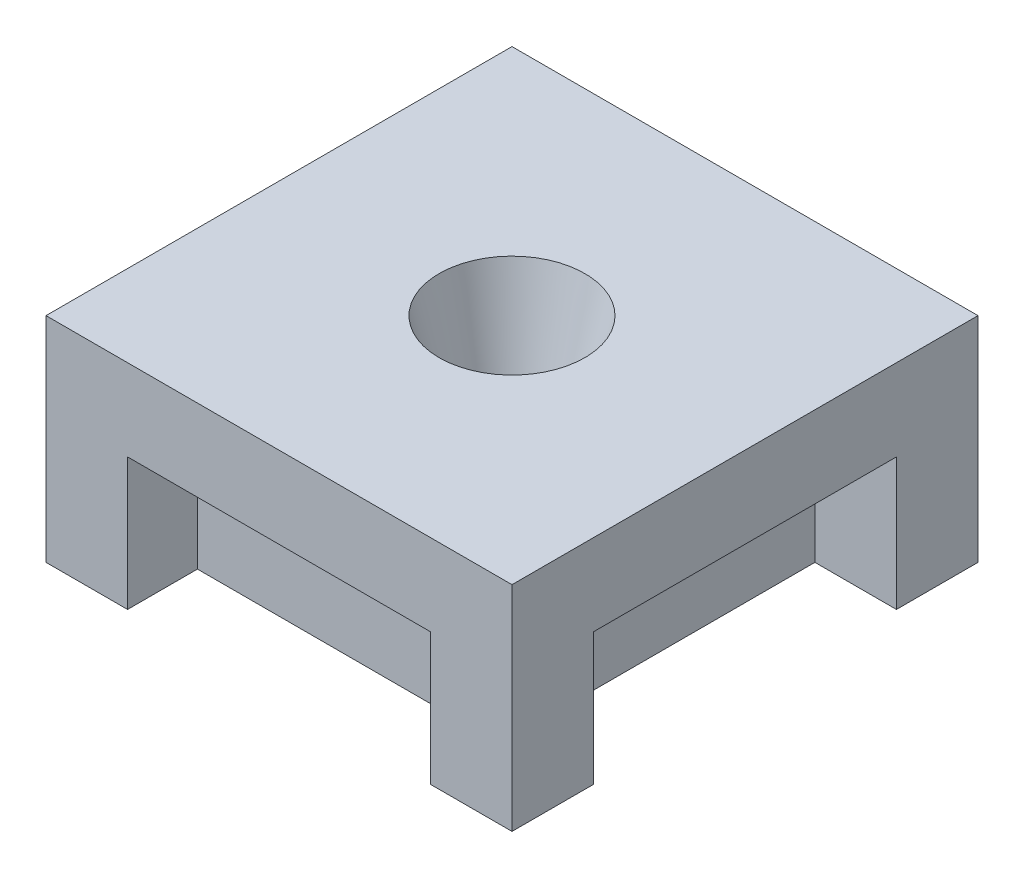
ISO-10303-21;
HEADER;
FILE_DESCRIPTION(('STEP AP214'),'2;1');
FILE_NAME('part.step','',(''),(''),'','','');
FILE_SCHEMA(('AUTOMOTIVE_DESIGN { 1 0 10303 214 1 1 1 1 }'));
ENDSEC;
DATA;
#1=APPLICATION_CONTEXT('core data for automotive mechanical design processes');
#2=APPLICATION_PROTOCOL_DEFINITION('international standard','automotive_design',2000,#1);
#3=PRODUCT_CONTEXT('',#1,'mechanical');
#4=PRODUCT('Part','Part','',(#3));
#5=PRODUCT_RELATED_PRODUCT_CATEGORY('part','',(#4));
#6=PRODUCT_DEFINITION_FORMATION('','',#4);
#7=PRODUCT_DEFINITION_CONTEXT('part definition',#1,'design');
#8=PRODUCT_DEFINITION('design','',#6,#7);
#9=PRODUCT_DEFINITION_SHAPE('','',#8);
#10=(LENGTH_UNIT() NAMED_UNIT(*) SI_UNIT(.MILLI.,.METRE.));
#11=(NAMED_UNIT(*) PLANE_ANGLE_UNIT() SI_UNIT($,.RADIAN.));
#12=(NAMED_UNIT(*) SI_UNIT($,.STERADIAN.) SOLID_ANGLE_UNIT());
#13=UNCERTAINTY_MEASURE_WITH_UNIT(LENGTH_MEASURE(1.E-05),#10,'distance_accuracy_value','');
#14=(GEOMETRIC_REPRESENTATION_CONTEXT(3) GLOBAL_UNCERTAINTY_ASSIGNED_CONTEXT((#13)) GLOBAL_UNIT_ASSIGNED_CONTEXT((#10,
#11,#12)) REPRESENTATION_CONTEXT('',''));
#15=CARTESIAN_POINT('',(0.,0.,0.));
#16=DIRECTION('',(0.,0.,1.));
#17=DIRECTION('',(1.,0.,0.));
#18=AXIS2_PLACEMENT_3D('',#15,#16,#17);
#19=CARTESIAN_POINT('',(-33.7032003820875,40.,8.10068404045491));
#20=DIRECTION('',(1.,0.,0.));
#21=DIRECTION('',(0.,0.,-1.));
#22=AXIS2_PLACEMENT_3D('',#19,#20,#21);
#23=PLANE('',#22);
#24=DIRECTION('',(0.,0.,1.));
#25=VECTOR('',#24,1.);
#26=CARTESIAN_POINT('',(-33.7032003820875,21.6555505287818,-22.8993159595451));
#27=LINE('',#26,#25);
#28=CARTESIAN_POINT('',(-33.7032003820875,21.6555505287818,41.1006840404549));
#29=VERTEX_POINT('',#28);
#30=CARTESIAN_POINT('',(-33.7032003820875,21.6555505287818,48.1006840404549));
#31=VERTEX_POINT('',#30);
#32=EDGE_CURVE('E186',#29,#31,#27,.T.);
#33=ORIENTED_EDGE('',*,*,#32,.T.);
#34=DIRECTION('',(0.,-1.,0.));
#35=VECTOR('',#34,1.);
#36=CARTESIAN_POINT('',(-33.7032003820875,40.,48.1006840404549));
#37=LINE('',#36,#35);
#38=CARTESIAN_POINT('',(-33.7032003820875,40.,48.1006840404549));
#39=VERTEX_POINT('',#38);
#40=EDGE_CURVE('E216',#39,#31,#37,.T.);
#41=ORIENTED_EDGE('',*,*,#40,.F.);
#42=DIRECTION('',(0.,0.,1.));
#43=VECTOR('',#42,1.);
#44=CARTESIAN_POINT('',(-33.7032003820875,40.,8.10068404045491));
#45=LINE('',#44,#43);
#46=CARTESIAN_POINT('',(-33.7032003820875,40.,8.10068404045491));
#47=VERTEX_POINT('',#46);
#48=EDGE_CURVE('E203',#47,#39,#45,.T.);
#49=ORIENTED_EDGE('',*,*,#48,.F.);
#50=DIRECTION('',(0.,-1.,0.));
#51=VECTOR('',#50,1.);
#52=CARTESIAN_POINT('',(-33.7032003820875,40.,8.10068404045491));
#53=LINE('',#52,#51);
#54=CARTESIAN_POINT('',(-33.7032003820875,21.6555505287818,8.10068404045491));
#55=VERTEX_POINT('',#54);
#56=EDGE_CURVE('E193',#47,#55,#53,.T.);
#57=ORIENTED_EDGE('',*,*,#56,.T.);
#58=CARTESIAN_POINT('',(-33.7032003820875,21.6555505287818,15.1006840404549));
#59=VERTEX_POINT('',#58);
#60=EDGE_CURVE('E175',#55,#59,#27,.T.);
#61=ORIENTED_EDGE('',*,*,#60,.T.);
#62=DIRECTION('',(0.,-1.,0.));
#63=VECTOR('',#62,1.);
#64=CARTESIAN_POINT('',(-33.7032003820875,33.,15.1006840404549));
#65=LINE('',#64,#63);
#66=CARTESIAN_POINT('',(-33.7032003820875,33.,15.1006840404549));
#67=VERTEX_POINT('',#66);
#68=EDGE_CURVE('E393',#67,#59,#65,.T.);
#69=ORIENTED_EDGE('',*,*,#68,.F.);
#70=DIRECTION('',(0.,0.,-1.));
#71=VECTOR('',#70,1.);
#72=CARTESIAN_POINT('',(-33.7032003820875,33.,41.1006840404549));
#73=LINE('',#72,#71);
#74=CARTESIAN_POINT('',(-33.7032003820875,33.,41.1006840404549));
#75=VERTEX_POINT('',#74);
#76=EDGE_CURVE('E401',#75,#67,#73,.T.);
#77=ORIENTED_EDGE('',*,*,#76,.F.);
#78=DIRECTION('',(0.,1.,0.));
#79=VECTOR('',#78,1.);
#80=CARTESIAN_POINT('',(-33.7032003820875,33.,41.1006840404549));
#81=LINE('',#80,#79);
#82=EDGE_CURVE('E61',#29,#75,#81,.T.);
#83=ORIENTED_EDGE('',*,*,#82,.F.);
#84=EDGE_LOOP('',(#33,#41,#49,#57,#61,#69,#77,#83));
#85=FACE_BOUND('',#84,.T.);
#86=ADVANCED_FACE('F39',(#85),#23,.F.);
#87=CARTESIAN_POINT('',(-33.7032003820875,40.,48.1006840404549));
#88=DIRECTION('',(0.,0.,-1.));
#89=DIRECTION('',(-1.,0.,0.));
#90=AXIS2_PLACEMENT_3D('',#87,#88,#89);
#91=PLANE('',#90);
#92=DIRECTION('',(-1.,0.,0.));
#93=VECTOR('',#92,1.);
#94=CARTESIAN_POINT('',(-33.7032003820875,21.6555505287818,48.1006840404549));
#95=LINE('',#94,#93);
#96=CARTESIAN_POINT('',(6.29679961791253,21.6555505287818,48.1006840404549));
#97=VERTEX_POINT('',#96);
#98=CARTESIAN_POINT('',(-0.703200382087465,21.6555505287818,48.1006840404549));
#99=VERTEX_POINT('',#98);
#100=EDGE_CURVE('E430',#97,#99,#95,.T.);
#101=ORIENTED_EDGE('',*,*,#100,.F.);
#102=DIRECTION('',(0.,-1.,0.));
#103=VECTOR('',#102,1.);
#104=CARTESIAN_POINT('',(6.29679961791253,40.,48.1006840404549));
#105=LINE('',#104,#103);
#106=CARTESIAN_POINT('',(6.29679961791253,40.,48.1006840404549));
#107=VERTEX_POINT('',#106);
#108=EDGE_CURVE('E208',#107,#97,#105,.T.);
#109=ORIENTED_EDGE('',*,*,#108,.F.);
#110=DIRECTION('',(1.,0.,0.));
#111=VECTOR('',#110,1.);
#112=CARTESIAN_POINT('',(-33.7032003820875,40.,48.1006840404549));
#113=LINE('',#112,#111);
#114=EDGE_CURVE('E409',#39,#107,#113,.T.);
#115=ORIENTED_EDGE('',*,*,#114,.F.);
#116=ORIENTED_EDGE('',*,*,#40,.T.);
#117=CARTESIAN_POINT('',(-26.7032003820875,21.6555505287818,48.1006840404549));
#118=VERTEX_POINT('',#117);
#119=EDGE_CURVE('E446',#118,#31,#95,.T.);
#120=ORIENTED_EDGE('',*,*,#119,.F.);
#121=DIRECTION('',(0.,-1.,0.));
#122=VECTOR('',#121,1.);
#123=CARTESIAN_POINT('',(-26.7032003820875,33.,48.1006840404549));
#124=LINE('',#123,#122);
#125=CARTESIAN_POINT('',(-26.7032003820875,33.,48.1006840404549));
#126=VERTEX_POINT('',#125);
#127=EDGE_CURVE('E347',#126,#118,#124,.T.);
#128=ORIENTED_EDGE('',*,*,#127,.F.);
#129=DIRECTION('',(-1.,0.,0.));
#130=VECTOR('',#129,1.);
#131=CARTESIAN_POINT('',(-26.7032003820875,33.,48.1006840404549));
#132=LINE('',#131,#130);
#133=CARTESIAN_POINT('',(-0.703200382087467,33.,48.1006840404549));
#134=VERTEX_POINT('',#133);
#135=EDGE_CURVE('E354',#134,#126,#132,.T.);
#136=ORIENTED_EDGE('',*,*,#135,.F.);
#137=DIRECTION('',(0.,1.,0.));
#138=VECTOR('',#137,1.);
#139=CARTESIAN_POINT('',(-0.703200382087467,33.,48.1006840404549));
#140=LINE('',#139,#138);
#141=EDGE_CURVE('E362',#99,#134,#140,.T.);
#142=ORIENTED_EDGE('',*,*,#141,.F.);
#143=EDGE_LOOP('',(#101,#109,#115,#116,#120,#128,#136,#142));
#144=FACE_BOUND('',#143,.T.);
#145=ADVANCED_FACE('F245',(#144),#91,.F.);
#146=CARTESIAN_POINT('',(6.29679961791253,40.,8.10068404045491));
#147=DIRECTION('',(-1.,0.,0.));
#148=DIRECTION('',(0.,0.,1.));
#149=AXIS2_PLACEMENT_3D('',#146,#147,#148);
#150=PLANE('',#149);
#151=DIRECTION('',(0.,0.,1.));
#152=VECTOR('',#151,1.);
#153=CARTESIAN_POINT('',(6.29679961791253,21.6555505287818,-22.8993159595451));
#154=LINE('',#153,#152);
#155=CARTESIAN_POINT('',(6.29679961791253,21.6555505287818,8.10068404045491));
#156=VERTEX_POINT('',#155);
#157=CARTESIAN_POINT('',(6.29679961791253,21.6555505287818,15.1006840404549));
#158=VERTEX_POINT('',#157);
#159=EDGE_CURVE('E416',#156,#158,#154,.T.);
#160=ORIENTED_EDGE('',*,*,#159,.F.);
#161=DIRECTION('',(0.,-1.,0.));
#162=VECTOR('',#161,1.);
#163=CARTESIAN_POINT('',(6.29679961791253,40.,8.10068404045491));
#164=LINE('',#163,#162);
#165=CARTESIAN_POINT('',(6.29679961791253,40.,8.10068404045491));
#166=VERTEX_POINT('',#165);
#167=EDGE_CURVE('E204',#166,#156,#164,.T.);
#168=ORIENTED_EDGE('',*,*,#167,.F.);
#169=DIRECTION('',(0.,0.,-1.));
#170=VECTOR('',#169,1.);
#171=CARTESIAN_POINT('',(6.29679961791253,40.,8.10068404045491));
#172=LINE('',#171,#170);
#173=EDGE_CURVE('E210',#107,#166,#172,.T.);
#174=ORIENTED_EDGE('',*,*,#173,.F.);
#175=ORIENTED_EDGE('',*,*,#108,.T.);
#176=CARTESIAN_POINT('',(6.29679961791253,21.6555505287818,41.1006840404549));
#177=VERTEX_POINT('',#176);
#178=EDGE_CURVE('E450',#177,#97,#154,.T.);
#179=ORIENTED_EDGE('',*,*,#178,.F.);
#180=DIRECTION('',(0.,-1.,0.));
#181=VECTOR('',#180,1.);
#182=CARTESIAN_POINT('',(6.29679961791253,33.,41.1006840404549));
#183=LINE('',#182,#181);
#184=CARTESIAN_POINT('',(6.29679961791253,33.,41.1006840404549));
#185=VERTEX_POINT('',#184);
#186=EDGE_CURVE('E341',#185,#177,#183,.T.);
#187=ORIENTED_EDGE('',*,*,#186,.F.);
#188=DIRECTION('',(0.,0.,1.));
#189=VECTOR('',#188,1.);
#190=CARTESIAN_POINT('',(6.29679961791253,33.,41.1006840404549));
#191=LINE('',#190,#189);
#192=CARTESIAN_POINT('',(6.29679961791253,33.,15.1006840404549));
#193=VERTEX_POINT('',#192);
#194=EDGE_CURVE('E329',#193,#185,#191,.T.);
#195=ORIENTED_EDGE('',*,*,#194,.F.);
#196=DIRECTION('',(0.,1.,0.));
#197=VECTOR('',#196,1.);
#198=CARTESIAN_POINT('',(6.29679961791253,33.,15.1006840404549));
#199=LINE('',#198,#197);
#200=EDGE_CURVE('E333',#158,#193,#199,.T.);
#201=ORIENTED_EDGE('',*,*,#200,.F.);
#202=EDGE_LOOP('',(#160,#168,#174,#175,#179,#187,#195,#201));
#203=FACE_BOUND('',#202,.T.);
#204=ADVANCED_FACE('F249',(#203),#150,.F.);
#205=CARTESIAN_POINT('',(-33.7032003820875,40.,8.10068404045491));
#206=DIRECTION('',(0.,0.,1.));
#207=DIRECTION('',(1.,0.,0.));
#208=AXIS2_PLACEMENT_3D('',#205,#206,#207);
#209=PLANE('',#208);
#210=DIRECTION('',(1.,0.,0.));
#211=VECTOR('',#210,1.);
#212=CARTESIAN_POINT('',(-33.7032003820875,21.6555505287818,8.10068404045491));
#213=LINE('',#212,#211);
#214=CARTESIAN_POINT('',(-26.7032003820875,21.6555505287818,8.10068404045491));
#215=VERTEX_POINT('',#214);
#216=EDGE_CURVE('E178',#55,#215,#213,.T.);
#217=ORIENTED_EDGE('',*,*,#216,.F.);
#218=ORIENTED_EDGE('',*,*,#56,.F.);
#219=DIRECTION('',(-1.,0.,0.));
#220=VECTOR('',#219,1.);
#221=CARTESIAN_POINT('',(-33.7032003820875,40.,8.10068404045491));
#222=LINE('',#221,#220);
#223=EDGE_CURVE('E205',#166,#47,#222,.T.);
#224=ORIENTED_EDGE('',*,*,#223,.F.);
#225=ORIENTED_EDGE('',*,*,#167,.T.);
#226=CARTESIAN_POINT('',(-0.703200382087476,21.6555505287818,8.10068404045491));
#227=VERTEX_POINT('',#226);
#228=EDGE_CURVE('E198',#227,#156,#213,.T.);
#229=ORIENTED_EDGE('',*,*,#228,.F.);
#230=DIRECTION('',(0.,-1.,0.));
#231=VECTOR('',#230,1.);
#232=CARTESIAN_POINT('',(-0.703200382087474,33.,8.10068404045491));
#233=LINE('',#232,#231);
#234=CARTESIAN_POINT('',(-0.703200382087474,33.,8.10068404045491));
#235=VERTEX_POINT('',#234);
#236=EDGE_CURVE('E368',#235,#227,#233,.T.);
#237=ORIENTED_EDGE('',*,*,#236,.F.);
#238=DIRECTION('',(1.,0.,0.));
#239=VECTOR('',#238,1.);
#240=CARTESIAN_POINT('',(-0.703200382087474,33.,8.10068404045491));
#241=LINE('',#240,#239);
#242=CARTESIAN_POINT('',(-26.7032003820875,33.,8.10068404045491));
#243=VERTEX_POINT('',#242);
#244=EDGE_CURVE('E375',#243,#235,#241,.T.);
#245=ORIENTED_EDGE('',*,*,#244,.F.);
#246=DIRECTION('',(0.,1.,0.));
#247=VECTOR('',#246,1.);
#248=CARTESIAN_POINT('',(-26.7032003820875,33.,8.10068404045491));
#249=LINE('',#248,#247);
#250=EDGE_CURVE('E196',#215,#243,#249,.T.);
#251=ORIENTED_EDGE('',*,*,#250,.F.);
#252=EDGE_LOOP('',(#217,#218,#224,#225,#229,#237,#245,#251));
#253=FACE_BOUND('',#252,.T.);
#254=ADVANCED_FACE('F191',(#253),#209,.F.);
#255=CARTESIAN_POINT('',(-26.7032003820875,33.,41.1006840404549));
#256=DIRECTION('',(0.,0.,1.));
#257=DIRECTION('',(1.,0.,0.));
#258=AXIS2_PLACEMENT_3D('',#255,#256,#257);
#259=PLANE('',#258);
#260=DIRECTION('',(1.,0.,0.));
#261=VECTOR('',#260,1.);
#262=CARTESIAN_POINT('',(-26.7032003820875,21.6555505287818,41.1006840404549));
#263=LINE('',#262,#261);
#264=CARTESIAN_POINT('',(-26.7032003820875,21.6555505287818,41.1006840404549));
#265=VERTEX_POINT('',#264);
#266=EDGE_CURVE('E435',#29,#265,#263,.T.);
#267=ORIENTED_EDGE('',*,*,#266,.F.);
#268=ORIENTED_EDGE('',*,*,#82,.T.);
#269=DIRECTION('',(-1.,0.,0.));
#270=VECTOR('',#269,1.);
#271=CARTESIAN_POINT('',(-26.7032003820875,33.,41.1006840404549));
#272=LINE('',#271,#270);
#273=CARTESIAN_POINT('',(-26.7032003820875,33.,41.1006840404549));
#274=VERTEX_POINT('',#273);
#275=EDGE_CURVE('E399',#274,#75,#272,.T.);
#276=ORIENTED_EDGE('',*,*,#275,.F.);
#277=DIRECTION('',(0.,1.,0.));
#278=VECTOR('',#277,1.);
#279=CARTESIAN_POINT('',(-26.7032003820875,33.,41.1006840404549));
#280=LINE('',#279,#278);
#281=EDGE_CURVE('E390',#265,#274,#280,.T.);
#282=ORIENTED_EDGE('',*,*,#281,.F.);
#283=EDGE_LOOP('',(#267,#268,#276,#282));
#284=FACE_BOUND('',#283,.T.);
#285=ADVANCED_FACE('F258',(#284),#259,.F.);
#286=CARTESIAN_POINT('',(-26.7032003820875,33.,15.1006840404549));
#287=DIRECTION('',(0.,0.,-1.));
#288=DIRECTION('',(-1.,0.,0.));
#289=AXIS2_PLACEMENT_3D('',#286,#287,#288);
#290=PLANE('',#289);
#291=DIRECTION('',(-1.,0.,0.));
#292=VECTOR('',#291,1.);
#293=CARTESIAN_POINT('',(-26.7032003820875,21.6555505287818,15.1006840404549));
#294=LINE('',#293,#292);
#295=CARTESIAN_POINT('',(-26.7032003820875,21.6555505287818,15.1006840404549));
#296=VERTEX_POINT('',#295);
#297=EDGE_CURVE('E181',#296,#59,#294,.T.);
#298=ORIENTED_EDGE('',*,*,#297,.F.);
#299=DIRECTION('',(0.,-1.,0.));
#300=VECTOR('',#299,1.);
#301=CARTESIAN_POINT('',(-26.7032003820875,33.,15.1006840404549));
#302=LINE('',#301,#300);
#303=CARTESIAN_POINT('',(-26.7032003820875,33.,15.1006840404549));
#304=VERTEX_POINT('',#303);
#305=EDGE_CURVE('E396',#304,#296,#302,.T.);
#306=ORIENTED_EDGE('',*,*,#305,.F.);
#307=DIRECTION('',(-1.,0.,0.));
#308=VECTOR('',#307,1.);
#309=CARTESIAN_POINT('',(-26.7032003820875,33.,15.1006840404549));
#310=LINE('',#309,#308);
#311=EDGE_CURVE('E405',#304,#67,#310,.T.);
#312=ORIENTED_EDGE('',*,*,#311,.T.);
#313=ORIENTED_EDGE('',*,*,#68,.T.);
#314=EDGE_LOOP('',(#298,#306,#312,#313));
#315=FACE_BOUND('',#314,.T.);
#316=ADVANCED_FACE('F267',(#315),#290,.F.);
#317=CARTESIAN_POINT('',(-26.7032003820875,0.,0.));
#318=DIRECTION('',(1.,0.,0.));
#319=DIRECTION('',(0.,0.,-1.));
#320=AXIS2_PLACEMENT_3D('',#317,#318,#319);
#321=PLANE('',#320);
#322=DIRECTION('',(0.,0.,-1.));
#323=VECTOR('',#322,1.);
#324=CARTESIAN_POINT('',(-26.7032003820875,21.6555505287818,0.));
#325=LINE('',#324,#323);
#326=EDGE_CURVE('E197',#265,#296,#325,.T.);
#327=ORIENTED_EDGE('',*,*,#326,.F.);
#328=ORIENTED_EDGE('',*,*,#281,.T.);
#329=DIRECTION('',(0.,0.,-1.));
#330=VECTOR('',#329,1.);
#331=CARTESIAN_POINT('',(-26.7032003820875,33.,41.1006840404549));
#332=LINE('',#331,#330);
#333=EDGE_CURVE('E392',#274,#304,#332,.T.);
#334=ORIENTED_EDGE('',*,*,#333,.T.);
#335=ORIENTED_EDGE('',*,*,#305,.T.);
#336=EDGE_LOOP('',(#327,#328,#334,#335));
#337=FACE_BOUND('',#336,.T.);
#338=ADVANCED_FACE('F274',(#337),#321,.F.);
#339=CARTESIAN_POINT('',(-0.703200382087474,33.,14.1006840404549));
#340=DIRECTION('',(1.,0.,0.));
#341=DIRECTION('',(0.,1.,0.));
#342=AXIS2_PLACEMENT_3D('',#339,#340,#341);
#343=PLANE('',#342);
#344=DIRECTION('',(0.,0.,-1.));
#345=VECTOR('',#344,1.);
#346=CARTESIAN_POINT('',(-0.703200382087476,21.6555505287818,14.1006840404549));
#347=LINE('',#346,#345);
#348=CARTESIAN_POINT('',(-0.703200382087474,21.6555505287818,14.1006840404549));
#349=VERTEX_POINT('',#348);
#350=EDGE_CURVE('E419',#349,#227,#347,.T.);
#351=ORIENTED_EDGE('',*,*,#350,.F.);
#352=DIRECTION('',(0.,-1.,0.));
#353=VECTOR('',#352,1.);
#354=CARTESIAN_POINT('',(-0.703200382087474,33.,14.1006840404549));
#355=LINE('',#354,#353);
#356=CARTESIAN_POINT('',(-0.703200382087474,33.,14.1006840404549));
#357=VERTEX_POINT('',#356);
#358=EDGE_CURVE('E371',#357,#349,#355,.T.);
#359=ORIENTED_EDGE('',*,*,#358,.F.);
#360=DIRECTION('',(0.,0.,-1.));
#361=VECTOR('',#360,1.);
#362=CARTESIAN_POINT('',(-0.703200382087474,33.,14.1006840404549));
#363=LINE('',#362,#361);
#364=EDGE_CURVE('E386',#357,#235,#363,.T.);
#365=ORIENTED_EDGE('',*,*,#364,.T.);
#366=ORIENTED_EDGE('',*,*,#236,.T.);
#367=EDGE_LOOP('',(#351,#359,#365,#366));
#368=FACE_BOUND('',#367,.T.);
#369=ADVANCED_FACE('F278',(#368),#343,.F.);
#370=CARTESIAN_POINT('',(-26.7032003820875,33.,14.1006840404549));
#371=DIRECTION('',(-1.,0.,0.));
#372=DIRECTION('',(0.,-1.,0.));
#373=AXIS2_PLACEMENT_3D('',#370,#371,#372);
#374=PLANE('',#373);
#375=DIRECTION('',(0.,0.,1.));
#376=VECTOR('',#375,1.);
#377=CARTESIAN_POINT('',(-26.7032003820875,21.6555505287818,14.1006840404549));
#378=LINE('',#377,#376);
#379=CARTESIAN_POINT('',(-26.7032003820875,21.6555505287818,14.1006840404549));
#380=VERTEX_POINT('',#379);
#381=EDGE_CURVE('E425',#215,#380,#378,.T.);
#382=ORIENTED_EDGE('',*,*,#381,.F.);
#383=ORIENTED_EDGE('',*,*,#250,.T.);
#384=DIRECTION('',(0.,0.,-1.));
#385=VECTOR('',#384,1.);
#386=CARTESIAN_POINT('',(-26.7032003820875,33.,14.1006840404549));
#387=LINE('',#386,#385);
#388=CARTESIAN_POINT('',(-26.7032003820875,33.,14.1006840404549));
#389=VERTEX_POINT('',#388);
#390=EDGE_CURVE('E380',#389,#243,#387,.T.);
#391=ORIENTED_EDGE('',*,*,#390,.F.);
#392=DIRECTION('',(0.,1.,0.));
#393=VECTOR('',#392,1.);
#394=CARTESIAN_POINT('',(-26.7032003820875,33.,14.1006840404549));
#395=LINE('',#394,#393);
#396=EDGE_CURVE('E374',#380,#389,#395,.T.);
#397=ORIENTED_EDGE('',*,*,#396,.F.);
#398=EDGE_LOOP('',(#382,#383,#391,#397));
#399=FACE_BOUND('',#398,.T.);
#400=ADVANCED_FACE('F282',(#399),#374,.F.);
#401=CARTESIAN_POINT('',(0.,0.,14.1006840404549));
#402=DIRECTION('',(0.,0.,-1.));
#403=DIRECTION('',(-1.,0.,0.));
#404=AXIS2_PLACEMENT_3D('',#401,#402,#403);
#405=PLANE('',#404);
#406=ORIENTED_EDGE('',*,*,#358,.T.);
#407=DIRECTION('',(-1.,0.,0.));
#408=VECTOR('',#407,1.);
#409=CARTESIAN_POINT('',(0.,21.6555505287818,14.1006840404549));
#410=LINE('',#409,#408);
#411=EDGE_CURVE('E427',#349,#380,#410,.T.);
#412=ORIENTED_EDGE('',*,*,#411,.T.);
#413=ORIENTED_EDGE('',*,*,#396,.T.);
#414=DIRECTION('',(1.,0.,0.));
#415=VECTOR('',#414,1.);
#416=CARTESIAN_POINT('',(-0.703200382087474,33.,14.1006840404549));
#417=LINE('',#416,#415);
#418=EDGE_CURVE('E377',#389,#357,#417,.T.);
#419=ORIENTED_EDGE('',*,*,#418,.T.);
#420=EDGE_LOOP('',(#406,#412,#413,#419));
#421=FACE_BOUND('',#420,.T.);
#422=ADVANCED_FACE('F286',(#421),#405,.T.);
#423=CARTESIAN_POINT('',(-26.7032003820875,33.,42.1006840404549));
#424=DIRECTION('',(-1.,0.,0.));
#425=DIRECTION('',(0.,-1.,0.));
#426=AXIS2_PLACEMENT_3D('',#423,#424,#425);
#427=PLANE('',#426);
#428=DIRECTION('',(0.,0.,1.));
#429=VECTOR('',#428,1.);
#430=CARTESIAN_POINT('',(-26.7032003820875,21.6555505287818,42.1006840404549));
#431=LINE('',#430,#429);
#432=CARTESIAN_POINT('',(-26.7032003820875,21.6555505287818,42.1006840404549));
#433=VERTEX_POINT('',#432);
#434=EDGE_CURVE('E463',#433,#118,#431,.T.);
#435=ORIENTED_EDGE('',*,*,#434,.F.);
#436=DIRECTION('',(0.,-1.,0.));
#437=VECTOR('',#436,1.);
#438=CARTESIAN_POINT('',(-26.7032003820875,33.,42.1006840404549));
#439=LINE('',#438,#437);
#440=CARTESIAN_POINT('',(-26.7032003820875,33.,42.1006840404549));
#441=VERTEX_POINT('',#440);
#442=EDGE_CURVE('E350',#441,#433,#439,.T.);
#443=ORIENTED_EDGE('',*,*,#442,.F.);
#444=DIRECTION('',(0.,0.,1.));
#445=VECTOR('',#444,1.);
#446=CARTESIAN_POINT('',(-26.7032003820875,33.,42.1006840404549));
#447=LINE('',#446,#445);
#448=EDGE_CURVE('E366',#441,#126,#447,.T.);
#449=ORIENTED_EDGE('',*,*,#448,.T.);
#450=ORIENTED_EDGE('',*,*,#127,.T.);
#451=EDGE_LOOP('',(#435,#443,#449,#450));
#452=FACE_BOUND('',#451,.T.);
#453=ADVANCED_FACE('F293',(#452),#427,.F.);
#454=CARTESIAN_POINT('',(-0.703200382087467,33.,42.1006840404549));
#455=DIRECTION('',(1.,0.,0.));
#456=DIRECTION('',(0.,1.,0.));
#457=AXIS2_PLACEMENT_3D('',#454,#455,#456);
#458=PLANE('',#457);
#459=DIRECTION('',(0.,0.,-1.));
#460=VECTOR('',#459,1.);
#461=CARTESIAN_POINT('',(-0.703200382087465,21.6555505287818,42.1006840404549));
#462=LINE('',#461,#460);
#463=CARTESIAN_POINT('',(-0.703200382087463,21.6555505287818,42.1006840404549));
#464=VERTEX_POINT('',#463);
#465=EDGE_CURVE('E461',#99,#464,#462,.T.);
#466=ORIENTED_EDGE('',*,*,#465,.F.);
#467=ORIENTED_EDGE('',*,*,#141,.T.);
#468=DIRECTION('',(0.,0.,1.));
#469=VECTOR('',#468,1.);
#470=CARTESIAN_POINT('',(-0.703200382087467,33.,42.1006840404549));
#471=LINE('',#470,#469);
#472=CARTESIAN_POINT('',(-0.703200382087467,33.,42.1006840404549));
#473=VERTEX_POINT('',#472);
#474=EDGE_CURVE('E359',#473,#134,#471,.T.);
#475=ORIENTED_EDGE('',*,*,#474,.F.);
#476=DIRECTION('',(0.,1.,0.));
#477=VECTOR('',#476,1.);
#478=CARTESIAN_POINT('',(-0.703200382087467,33.,42.1006840404549));
#479=LINE('',#478,#477);
#480=EDGE_CURVE('E353',#464,#473,#479,.T.);
#481=ORIENTED_EDGE('',*,*,#480,.F.);
#482=EDGE_LOOP('',(#466,#467,#475,#481));
#483=FACE_BOUND('',#482,.T.);
#484=ADVANCED_FACE('F297',(#483),#458,.F.);
#485=CARTESIAN_POINT('',(0.,0.,42.1006840404549));
#486=DIRECTION('',(0.,0.,1.));
#487=DIRECTION('',(1.,0.,0.));
#488=AXIS2_PLACEMENT_3D('',#485,#486,#487);
#489=PLANE('',#488);
#490=ORIENTED_EDGE('',*,*,#442,.T.);
#491=DIRECTION('',(1.,0.,0.));
#492=VECTOR('',#491,1.);
#493=CARTESIAN_POINT('',(0.,21.6555505287818,42.1006840404549));
#494=LINE('',#493,#492);
#495=EDGE_CURVE('E456',#433,#464,#494,.T.);
#496=ORIENTED_EDGE('',*,*,#495,.T.);
#497=ORIENTED_EDGE('',*,*,#480,.T.);
#498=DIRECTION('',(-1.,0.,0.));
#499=VECTOR('',#498,1.);
#500=CARTESIAN_POINT('',(-26.7032003820875,33.,42.1006840404549));
#501=LINE('',#500,#499);
#502=EDGE_CURVE('E356',#473,#441,#501,.T.);
#503=ORIENTED_EDGE('',*,*,#502,.T.);
#504=EDGE_LOOP('',(#490,#496,#497,#503));
#505=FACE_BOUND('',#504,.T.);
#506=ADVANCED_FACE('F301',(#505),#489,.T.);
#507=CARTESIAN_POINT('',(-0.703200382087469,33.,41.1006840404549));
#508=DIRECTION('',(0.,0.,1.));
#509=DIRECTION('',(0.,-1.,0.));
#510=AXIS2_PLACEMENT_3D('',#507,#508,#509);
#511=PLANE('',#510);
#512=DIRECTION('',(1.,0.,0.));
#513=VECTOR('',#512,1.);
#514=CARTESIAN_POINT('',(-0.703200382087469,21.6555505287818,41.1006840404549));
#515=LINE('',#514,#513);
#516=CARTESIAN_POINT('',(-0.70320038208747,21.6555505287818,41.1006840404549));
#517=VERTEX_POINT('',#516);
#518=EDGE_CURVE('E453',#517,#177,#515,.T.);
#519=ORIENTED_EDGE('',*,*,#518,.F.);
#520=DIRECTION('',(0.,-1.,0.));
#521=VECTOR('',#520,1.);
#522=CARTESIAN_POINT('',(-0.703200382087469,33.,41.1006840404549));
#523=LINE('',#522,#521);
#524=CARTESIAN_POINT('',(-0.703200382087469,33.,41.1006840404549));
#525=VERTEX_POINT('',#524);
#526=EDGE_CURVE('E323',#525,#517,#523,.T.);
#527=ORIENTED_EDGE('',*,*,#526,.F.);
#528=DIRECTION('',(1.,0.,0.));
#529=VECTOR('',#528,1.);
#530=CARTESIAN_POINT('',(-0.703200382087469,33.,41.1006840404549));
#531=LINE('',#530,#529);
#532=EDGE_CURVE('E345',#525,#185,#531,.T.);
#533=ORIENTED_EDGE('',*,*,#532,.T.);
#534=ORIENTED_EDGE('',*,*,#186,.T.);
#535=EDGE_LOOP('',(#519,#527,#533,#534));
#536=FACE_BOUND('',#535,.T.);
#537=ADVANCED_FACE('F308',(#536),#511,.F.);
#538=CARTESIAN_POINT('',(-0.703200382087474,33.,15.1006840404549));
#539=DIRECTION('',(0.,0.,-1.));
#540=DIRECTION('',(-1.,0.,0.));
#541=AXIS2_PLACEMENT_3D('',#538,#539,#540);
#542=PLANE('',#541);
#543=DIRECTION('',(-1.,0.,0.));
#544=VECTOR('',#543,1.);
#545=CARTESIAN_POINT('',(-0.703200382087474,21.6555505287818,15.1006840404549));
#546=LINE('',#545,#544);
#547=CARTESIAN_POINT('',(-0.703200382087474,21.6555505287818,15.1006840404549));
#548=VERTEX_POINT('',#547);
#549=EDGE_CURVE('E54',#158,#548,#546,.T.);
#550=ORIENTED_EDGE('',*,*,#549,.F.);
#551=ORIENTED_EDGE('',*,*,#200,.T.);
#552=DIRECTION('',(1.,0.,0.));
#553=VECTOR('',#552,1.);
#554=CARTESIAN_POINT('',(-0.703200382087474,33.,15.1006840404549));
#555=LINE('',#554,#553);
#556=CARTESIAN_POINT('',(-0.703200382087474,33.,15.1006840404549));
#557=VERTEX_POINT('',#556);
#558=EDGE_CURVE('E340',#557,#193,#555,.T.);
#559=ORIENTED_EDGE('',*,*,#558,.F.);
#560=DIRECTION('',(0.,1.,0.));
#561=VECTOR('',#560,1.);
#562=CARTESIAN_POINT('',(-0.703200382087474,33.,15.1006840404549));
#563=LINE('',#562,#561);
#564=EDGE_CURVE('E328',#548,#557,#563,.T.);
#565=ORIENTED_EDGE('',*,*,#564,.F.);
#566=EDGE_LOOP('',(#550,#551,#559,#565));
#567=FACE_BOUND('',#566,.T.);
#568=ADVANCED_FACE('F312',(#567),#542,.F.);
#569=CARTESIAN_POINT('',(-0.703200382087476,0.,0.));
#570=DIRECTION('',(1.,0.,0.));
#571=DIRECTION('',(0.,0.,-1.));
#572=AXIS2_PLACEMENT_3D('',#569,#570,#571);
#573=PLANE('',#572);
#574=ORIENTED_EDGE('',*,*,#526,.T.);
#575=DIRECTION('',(0.,0.,-1.));
#576=VECTOR('',#575,1.);
#577=CARTESIAN_POINT('',(-0.703200382087476,21.6555505287818,0.));
#578=LINE('',#577,#576);
#579=EDGE_CURVE('E12',#517,#548,#578,.T.);
#580=ORIENTED_EDGE('',*,*,#579,.T.);
#581=ORIENTED_EDGE('',*,*,#564,.T.);
#582=DIRECTION('',(0.,0.,1.));
#583=VECTOR('',#582,1.);
#584=CARTESIAN_POINT('',(-0.703200382087469,33.,41.1006840404549));
#585=LINE('',#584,#583);
#586=EDGE_CURVE('E326',#557,#525,#585,.T.);
#587=ORIENTED_EDGE('',*,*,#586,.T.);
#588=EDGE_LOOP('',(#574,#580,#581,#587));
#589=FACE_BOUND('',#588,.T.);
#590=ADVANCED_FACE('F263',(#589),#573,.T.);
#591=CARTESIAN_POINT('',(0.,40.,0.));
#592=DIRECTION('',(0.,1.,0.));
#593=DIRECTION('',(0.,0.,1.));
#594=AXIS2_PLACEMENT_3D('',#591,#592,#593);
#595=PLANE('',#594);
#596=CARTESIAN_POINT('',(-13.7032003820875,40.,28.1006840404549));
#597=DIRECTION('',(0.,1.,0.));
#598=DIRECTION('',(0.,0.,1.));
#599=AXIS2_PLACEMENT_3D('',#596,#597,#598);
#600=CIRCLE('',#599,6.255);
#601=CARTESIAN_POINT('',(-13.7032003820875,40.,34.3556840404549));
#602=VERTEX_POINT('',#601);
#603=EDGE_CURVE('E336',#602,#602,#600,.T.);
#604=ORIENTED_EDGE('',*,*,#603,.F.);
#605=EDGE_LOOP('',(#604));
#606=FACE_BOUND('',#605,.T.);
#607=ORIENTED_EDGE('',*,*,#48,.T.);
#608=ORIENTED_EDGE('',*,*,#114,.T.);
#609=ORIENTED_EDGE('',*,*,#173,.T.);
#610=ORIENTED_EDGE('',*,*,#223,.T.);
#611=EDGE_LOOP('',(#607,#608,#609,#610));
#612=FACE_BOUND('',#611,.T.);
#613=ADVANCED_FACE('F259',(#606,#612),#595,.T.);
#614=CARTESIAN_POINT('',(-26.7032003820875,33.,41.1006840404549));
#615=DIRECTION('',(0.,1.,0.));
#616=DIRECTION('',(0.,0.,1.));
#617=AXIS2_PLACEMENT_3D('',#614,#615,#616);
#618=PLANE('',#617);
#619=ORIENTED_EDGE('',*,*,#76,.T.);
#620=ORIENTED_EDGE('',*,*,#311,.F.);
#621=ORIENTED_EDGE('',*,*,#333,.F.);
#622=ORIENTED_EDGE('',*,*,#275,.T.);
#623=EDGE_LOOP('',(#619,#620,#621,#622));
#624=FACE_BOUND('',#623,.T.);
#625=ADVANCED_FACE('F262',(#624),#618,.F.);
#626=CARTESIAN_POINT('',(-0.703200382087474,33.,14.1006840404549));
#627=DIRECTION('',(0.,1.,0.));
#628=DIRECTION('',(0.,0.,1.));
#629=AXIS2_PLACEMENT_3D('',#626,#627,#628);
#630=PLANE('',#629);
#631=ORIENTED_EDGE('',*,*,#244,.T.);
#632=ORIENTED_EDGE('',*,*,#364,.F.);
#633=ORIENTED_EDGE('',*,*,#418,.F.);
#634=ORIENTED_EDGE('',*,*,#390,.T.);
#635=EDGE_LOOP('',(#631,#632,#633,#634));
#636=FACE_BOUND('',#635,.T.);
#637=ADVANCED_FACE('F270',(#636),#630,.F.);
#638=CARTESIAN_POINT('',(-26.7032003820875,33.,42.1006840404549));
#639=DIRECTION('',(0.,1.,0.));
#640=DIRECTION('',(0.,0.,1.));
#641=AXIS2_PLACEMENT_3D('',#638,#639,#640);
#642=PLANE('',#641);
#643=ORIENTED_EDGE('',*,*,#135,.T.);
#644=ORIENTED_EDGE('',*,*,#448,.F.);
#645=ORIENTED_EDGE('',*,*,#502,.F.);
#646=ORIENTED_EDGE('',*,*,#474,.T.);
#647=EDGE_LOOP('',(#643,#644,#645,#646));
#648=FACE_BOUND('',#647,.T.);
#649=ADVANCED_FACE('F240',(#648),#642,.F.);
#650=CARTESIAN_POINT('',(-0.703200382087469,33.,41.1006840404549));
#651=DIRECTION('',(0.,1.,0.));
#652=DIRECTION('',(0.,0.,1.));
#653=AXIS2_PLACEMENT_3D('',#650,#651,#652);
#654=PLANE('',#653);
#655=ORIENTED_EDGE('',*,*,#194,.T.);
#656=ORIENTED_EDGE('',*,*,#532,.F.);
#657=ORIENTED_EDGE('',*,*,#586,.F.);
#658=ORIENTED_EDGE('',*,*,#558,.T.);
#659=EDGE_LOOP('',(#655,#656,#657,#658));
#660=FACE_BOUND('',#659,.T.);
#661=ADVANCED_FACE('F233',(#660),#654,.F.);
#662=CARTESIAN_POINT('',(-13.7032003820875,24.13,28.1006840404549));
#663=DIRECTION('',(0.,1.,0.));
#664=DIRECTION('',(0.,0.,1.));
#665=AXIS2_PLACEMENT_3D('',#662,#663,#664);
#666=PLANE('',#665);
#667=CARTESIAN_POINT('',(-13.7032003820875,24.13,28.1006840404549));
#668=DIRECTION('',(0.,1.,0.));
#669=DIRECTION('',(0.,0.,1.));
#670=AXIS2_PLACEMENT_3D('',#667,#668,#669);
#671=CIRCLE('',#670,2.01667475030949);
#672=CARTESIAN_POINT('',(-13.7032003820875,24.13,30.1173587907644));
#673=VERTEX_POINT('',#672);
#674=EDGE_CURVE('E219',#673,#673,#671,.T.);
#675=ORIENTED_EDGE('',*,*,#674,.T.);
#676=EDGE_LOOP('',(#675));
#677=FACE_BOUND('',#676,.T.);
#678=ADVANCED_FACE('F231',(#677),#666,.T.);
#679=CARTESIAN_POINT('',(-13.7032003820875,24.13,28.1006840404549));
#680=DIRECTION('',(0.,1.,0.));
#681=DIRECTION('',(0.,0.,1.));
#682=AXIS2_PLACEMENT_3D('',#679,#680,#681);
#683=CONICAL_SURFACE('',#682,2.41,0.237700663151821);
#684=CARTESIAN_POINT('',(-13.7032003820875,24.5122657165816,28.1006840404549));
#685=DIRECTION('',(0.,-1.,0.));
#686=DIRECTION('',(0.,0.,-1.));
#687=AXIS2_PLACEMENT_3D('',#684,#685,#686);
#688=CIRCLE('',#687,2.50261573284538);
#689=CARTESIAN_POINT('',(-13.7032003820875,24.5122657165816,25.5980683076095));
#690=VERTEX_POINT('',#689);
#691=EDGE_CURVE('E47',#690,#690,#688,.T.);
#692=ORIENTED_EDGE('',*,*,#691,.T.);
#693=EDGE_LOOP('',(#692));
#694=FACE_BOUND('',#693,.T.);
#695=ORIENTED_EDGE('',*,*,#603,.T.);
#696=EDGE_LOOP('',(#695));
#697=FACE_BOUND('',#696,.T.);
#698=ADVANCED_FACE('F224',(#694,#697),#683,.F.);
#699=CARTESIAN_POINT('',(-13.7032003820875,24.63,28.1006840404549));
#700=DIRECTION('',(0.,1.,0.));
#701=DIRECTION('',(0.,0.,1.));
#702=AXIS2_PLACEMENT_3D('',#699,#700,#701);
#703=TOROIDAL_SURFACE('',#702,2.01667475030949,0.5);
#704=ORIENTED_EDGE('',*,*,#691,.F.);
#705=EDGE_LOOP('',(#704));
#706=FACE_BOUND('',#705,.T.);
#707=ORIENTED_EDGE('',*,*,#674,.F.);
#708=EDGE_LOOP('',(#707));
#709=FACE_BOUND('',#708,.T.);
#710=ADVANCED_FACE('F41',(#706,#709),#703,.F.);
#711=CARTESIAN_POINT('',(-33.7032003820875,21.6555505287818,-22.8993159595451));
#712=DIRECTION('',(0.,-1.,0.));
#713=DIRECTION('',(0.,0.,-1.));
#714=AXIS2_PLACEMENT_3D('',#711,#712,#713);
#715=PLANE('',#714);
#716=ORIENTED_EDGE('',*,*,#266,.T.);
#717=ORIENTED_EDGE('',*,*,#326,.T.);
#718=ORIENTED_EDGE('',*,*,#297,.T.);
#719=ORIENTED_EDGE('',*,*,#60,.F.);
#720=ORIENTED_EDGE('',*,*,#216,.T.);
#721=ORIENTED_EDGE('',*,*,#381,.T.);
#722=ORIENTED_EDGE('',*,*,#411,.F.);
#723=ORIENTED_EDGE('',*,*,#350,.T.);
#724=ORIENTED_EDGE('',*,*,#228,.T.);
#725=ORIENTED_EDGE('',*,*,#159,.T.);
#726=ORIENTED_EDGE('',*,*,#549,.T.);
#727=ORIENTED_EDGE('',*,*,#579,.F.);
#728=ORIENTED_EDGE('',*,*,#518,.T.);
#729=ORIENTED_EDGE('',*,*,#178,.T.);
#730=ORIENTED_EDGE('',*,*,#100,.T.);
#731=ORIENTED_EDGE('',*,*,#465,.T.);
#732=ORIENTED_EDGE('',*,*,#495,.F.);
#733=ORIENTED_EDGE('',*,*,#434,.T.);
#734=ORIENTED_EDGE('',*,*,#119,.T.);
#735=ORIENTED_EDGE('',*,*,#32,.F.);
#736=EDGE_LOOP('',(#716,#717,#718,#719,#720,#721,#722,#723,#724,#725,#726,#727,#728,#729,#730,
#731,#732,#733,#734,#735));
#737=FACE_BOUND('',#736,.T.);
#738=ADVANCED_FACE('F177',(#737),#715,.T.);
#739=CLOSED_SHELL('',(#86,#145,#204,#254,#285,#316,#338,#369,#400,#422,#453,#484,#506,#537,#568,
#590,#613,#625,#637,#649,#661,#678,#698,#710,#738));
#740=MANIFOLD_SOLID_BREP('B2',#739);
#741=ADVANCED_BREP_SHAPE_REPRESENTATION('',(#18,#740),#14);
#742=SHAPE_DEFINITION_REPRESENTATION(#9,#741);
ENDSEC;
END-ISO-10303-21;
